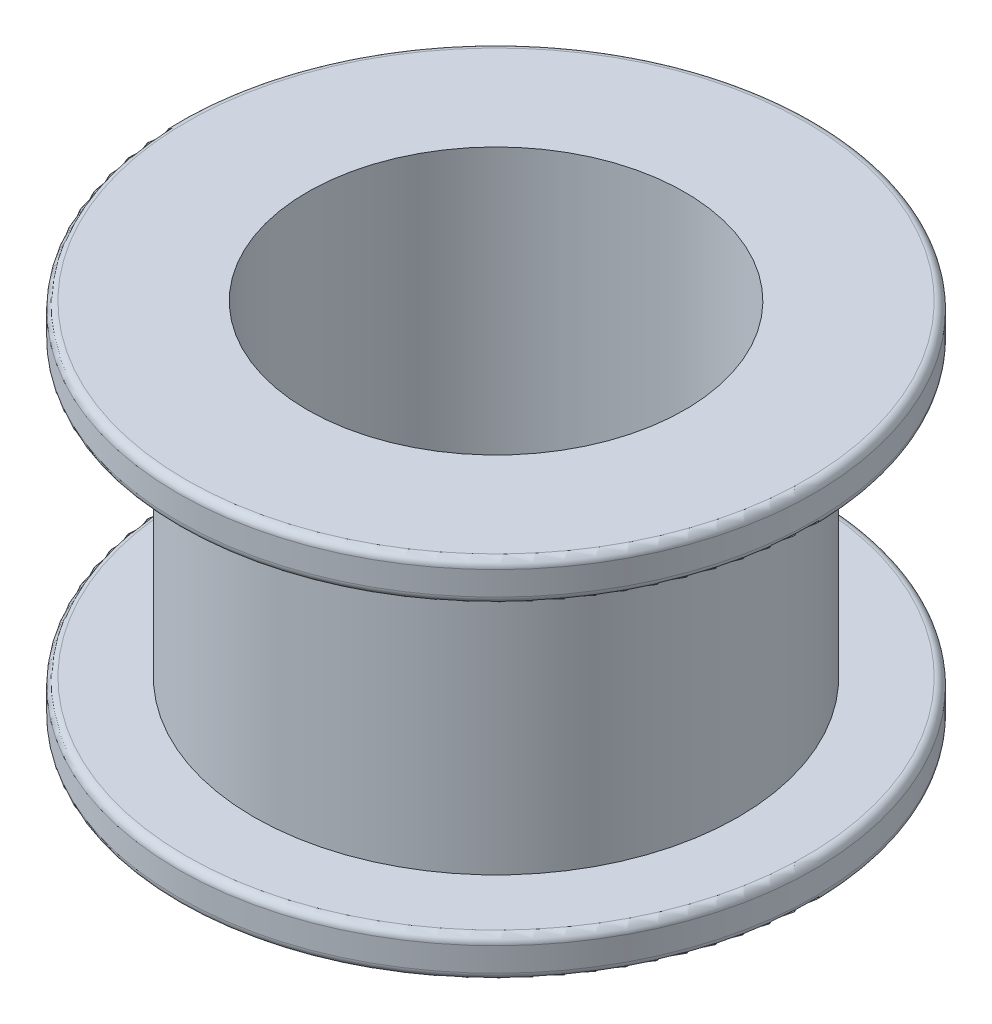
ISO-10303-21;
HEADER;
FILE_DESCRIPTION(('STEP AP214'),'2;1');
FILE_NAME('part.step','',(''),(''),'','','');
FILE_SCHEMA(('AUTOMOTIVE_DESIGN { 1 0 10303 214 1 1 1 1 }'));
ENDSEC;
DATA;
#1=APPLICATION_CONTEXT('core data for automotive mechanical design processes');
#2=APPLICATION_PROTOCOL_DEFINITION('international standard','automotive_design',2000,#1);
#3=PRODUCT_CONTEXT('',#1,'mechanical');
#4=PRODUCT('Part','Part','',(#3));
#5=PRODUCT_RELATED_PRODUCT_CATEGORY('part','',(#4));
#6=PRODUCT_DEFINITION_FORMATION('','',#4);
#7=PRODUCT_DEFINITION_CONTEXT('part definition',#1,'design');
#8=PRODUCT_DEFINITION('design','',#6,#7);
#9=PRODUCT_DEFINITION_SHAPE('','',#8);
#10=(LENGTH_UNIT() NAMED_UNIT(*) SI_UNIT(.MILLI.,.METRE.));
#11=(NAMED_UNIT(*) PLANE_ANGLE_UNIT() SI_UNIT($,.RADIAN.));
#12=(NAMED_UNIT(*) SI_UNIT($,.STERADIAN.) SOLID_ANGLE_UNIT());
#13=UNCERTAINTY_MEASURE_WITH_UNIT(LENGTH_MEASURE(1.E-05),#10,'distance_accuracy_value','');
#14=(GEOMETRIC_REPRESENTATION_CONTEXT(3) GLOBAL_UNCERTAINTY_ASSIGNED_CONTEXT((#13)) GLOBAL_UNIT_ASSIGNED_CONTEXT((#10,
#11,#12)) REPRESENTATION_CONTEXT('',''));
#15=CARTESIAN_POINT('',(0.,0.,0.));
#16=DIRECTION('',(0.,0.,1.));
#17=DIRECTION('',(1.,0.,0.));
#18=AXIS2_PLACEMENT_3D('',#15,#16,#17);
#19=CARTESIAN_POINT('',(0.,9.2,0.));
#20=DIRECTION('',(0.,-1.,0.));
#21=DIRECTION('',(0.,0.,-1.));
#22=AXIS2_PLACEMENT_3D('',#19,#20,#21);
#23=CYLINDRICAL_SURFACE('',#22,6.1);
#24=CARTESIAN_POINT('',(0.,1.,0.));
#25=DIRECTION('',(0.,1.,0.));
#26=DIRECTION('',(0.,0.,1.));
#27=AXIS2_PLACEMENT_3D('',#24,#25,#26);
#28=CIRCLE('',#27,6.1);
#29=CARTESIAN_POINT('',(0.,1.,6.1));
#30=VERTEX_POINT('',#29);
#31=EDGE_CURVE('E70',#30,#30,#28,.T.);
#32=ORIENTED_EDGE('',*,*,#31,.T.);
#33=EDGE_LOOP('',(#32));
#34=FACE_BOUND('',#33,.T.);
#35=CARTESIAN_POINT('',(0.,8.2,0.));
#36=DIRECTION('',(0.,1.,0.));
#37=DIRECTION('',(0.,0.,1.));
#38=AXIS2_PLACEMENT_3D('',#35,#36,#37);
#39=CIRCLE('',#38,6.1);
#40=CARTESIAN_POINT('',(0.,8.2,6.1));
#41=VERTEX_POINT('',#40);
#42=EDGE_CURVE('E63',#41,#41,#39,.T.);
#43=ORIENTED_EDGE('',*,*,#42,.F.);
#44=EDGE_LOOP('',(#43));
#45=FACE_BOUND('',#44,.T.);
#46=ADVANCED_FACE('F31',(#34,#45),#23,.T.);
#47=CARTESIAN_POINT('',(0.,9.2,0.));
#48=DIRECTION('',(0.,-1.,0.));
#49=DIRECTION('',(0.,0.,-1.));
#50=AXIS2_PLACEMENT_3D('',#47,#48,#49);
#51=CYLINDRICAL_SURFACE('',#50,4.75);
#52=CARTESIAN_POINT('',(0.,9.2,0.));
#53=DIRECTION('',(0.,1.,0.));
#54=DIRECTION('',(0.,0.,1.));
#55=AXIS2_PLACEMENT_3D('',#52,#53,#54);
#56=CIRCLE('',#55,4.75);
#57=CARTESIAN_POINT('',(0.,9.2,4.75));
#58=VERTEX_POINT('',#57);
#59=EDGE_CURVE('E66',#58,#58,#56,.T.);
#60=ORIENTED_EDGE('',*,*,#59,.T.);
#61=EDGE_LOOP('',(#60));
#62=FACE_BOUND('',#61,.T.);
#63=CARTESIAN_POINT('',(0.,0.,0.));
#64=DIRECTION('',(0.,1.,0.));
#65=DIRECTION('',(0.,0.,1.));
#66=AXIS2_PLACEMENT_3D('',#63,#64,#65);
#67=CIRCLE('',#66,4.75);
#68=CARTESIAN_POINT('',(0.,0.,4.75));
#69=VERTEX_POINT('',#68);
#70=EDGE_CURVE('E67',#69,#69,#67,.T.);
#71=ORIENTED_EDGE('',*,*,#70,.F.);
#72=EDGE_LOOP('',(#71));
#73=FACE_BOUND('',#72,.T.);
#74=ADVANCED_FACE('F94',(#62,#73),#51,.F.);
#75=CARTESIAN_POINT('',(0.,9.2,0.));
#76=DIRECTION('',(0.,1.,0.));
#77=DIRECTION('',(0.,0.,1.));
#78=AXIS2_PLACEMENT_3D('',#75,#76,#77);
#79=PLANE('',#78);
#80=CARTESIAN_POINT('',(0.,9.2,0.));
#81=DIRECTION('',(0.,1.,0.));
#82=DIRECTION('',(0.,0.,1.));
#83=AXIS2_PLACEMENT_3D('',#80,#81,#82);
#84=CIRCLE('',#83,7.8);
#85=CARTESIAN_POINT('',(0.,9.2,7.8));
#86=VERTEX_POINT('',#85);
#87=EDGE_CURVE('E60',#86,#86,#84,.T.);
#88=ORIENTED_EDGE('',*,*,#87,.T.);
#89=EDGE_LOOP('',(#88));
#90=FACE_BOUND('',#89,.T.);
#91=ORIENTED_EDGE('',*,*,#59,.F.);
#92=EDGE_LOOP('',(#91));
#93=FACE_BOUND('',#92,.T.);
#94=ADVANCED_FACE('F99',(#90,#93),#79,.T.);
#95=CARTESIAN_POINT('',(0.,0.,0.));
#96=DIRECTION('',(0.,1.,0.));
#97=DIRECTION('',(0.,0.,1.));
#98=AXIS2_PLACEMENT_3D('',#95,#96,#97);
#99=PLANE('',#98);
#100=CARTESIAN_POINT('',(0.,0.,0.));
#101=DIRECTION('',(0.,1.,0.));
#102=DIRECTION('',(0.,0.,1.));
#103=AXIS2_PLACEMENT_3D('',#100,#101,#102);
#104=CIRCLE('',#103,7.8);
#105=CARTESIAN_POINT('',(0.,0.,7.8));
#106=VERTEX_POINT('',#105);
#107=EDGE_CURVE('E38',#106,#106,#104,.F.);
#108=ORIENTED_EDGE('',*,*,#107,.T.);
#109=EDGE_LOOP('',(#108));
#110=FACE_BOUND('',#109,.T.);
#111=ORIENTED_EDGE('',*,*,#70,.T.);
#112=EDGE_LOOP('',(#111));
#113=FACE_BOUND('',#112,.T.);
#114=ADVANCED_FACE('F90',(#110,#113),#99,.F.);
#115=CARTESIAN_POINT('',(0.,1.,0.));
#116=DIRECTION('',(0.,-1.,0.));
#117=DIRECTION('',(0.,0.,-1.));
#118=AXIS2_PLACEMENT_3D('',#115,#116,#117);
#119=CYLINDRICAL_SURFACE('',#118,8.);
#120=CARTESIAN_POINT('',(0.,0.2,0.));
#121=DIRECTION('',(0.,1.,0.));
#122=DIRECTION('',(0.,0.,1.));
#123=AXIS2_PLACEMENT_3D('',#120,#121,#122);
#124=CIRCLE('',#123,8.);
#125=CARTESIAN_POINT('',(0.,0.2,8.));
#126=VERTEX_POINT('',#125);
#127=EDGE_CURVE('E42',#126,#126,#124,.T.);
#128=ORIENTED_EDGE('',*,*,#127,.T.);
#129=EDGE_LOOP('',(#128));
#130=FACE_BOUND('',#129,.T.);
#131=CARTESIAN_POINT('',(0.,0.8,0.));
#132=DIRECTION('',(0.,1.,0.));
#133=DIRECTION('',(0.,0.,1.));
#134=AXIS2_PLACEMENT_3D('',#131,#132,#133);
#135=CIRCLE('',#134,8.);
#136=CARTESIAN_POINT('',(0.,0.8,8.));
#137=VERTEX_POINT('',#136);
#138=EDGE_CURVE('E46',#137,#137,#135,.F.);
#139=ORIENTED_EDGE('',*,*,#138,.T.);
#140=EDGE_LOOP('',(#139));
#141=FACE_BOUND('',#140,.T.);
#142=ADVANCED_FACE('F81',(#130,#141),#119,.T.);
#143=CARTESIAN_POINT('',(0.,1.,0.));
#144=DIRECTION('',(0.,1.,0.));
#145=DIRECTION('',(0.,0.,1.));
#146=AXIS2_PLACEMENT_3D('',#143,#144,#145);
#147=PLANE('',#146);
#148=CARTESIAN_POINT('',(0.,1.,0.));
#149=DIRECTION('',(0.,1.,0.));
#150=DIRECTION('',(0.,0.,1.));
#151=AXIS2_PLACEMENT_3D('',#148,#149,#150);
#152=CIRCLE('',#151,7.8);
#153=CARTESIAN_POINT('',(0.,1.,7.8));
#154=VERTEX_POINT('',#153);
#155=EDGE_CURVE('E10',#154,#154,#152,.T.);
#156=ORIENTED_EDGE('',*,*,#155,.T.);
#157=EDGE_LOOP('',(#156));
#158=FACE_BOUND('',#157,.T.);
#159=ORIENTED_EDGE('',*,*,#31,.F.);
#160=EDGE_LOOP('',(#159));
#161=FACE_BOUND('',#160,.T.);
#162=ADVANCED_FACE('F78',(#158,#161),#147,.T.);
#163=CARTESIAN_POINT('',(0.,8.2,0.));
#164=DIRECTION('',(0.,1.,0.));
#165=DIRECTION('',(0.,0.,1.));
#166=AXIS2_PLACEMENT_3D('',#163,#164,#165);
#167=CYLINDRICAL_SURFACE('',#166,8.);
#168=CARTESIAN_POINT('',(0.,9.,0.));
#169=DIRECTION('',(0.,1.,0.));
#170=DIRECTION('',(0.,0.,1.));
#171=AXIS2_PLACEMENT_3D('',#168,#169,#170);
#172=CIRCLE('',#171,8.);
#173=CARTESIAN_POINT('',(0.,9.,8.));
#174=VERTEX_POINT('',#173);
#175=EDGE_CURVE('E54',#174,#174,#172,.F.);
#176=ORIENTED_EDGE('',*,*,#175,.T.);
#177=EDGE_LOOP('',(#176));
#178=FACE_BOUND('',#177,.T.);
#179=CARTESIAN_POINT('',(0.,8.4,0.));
#180=DIRECTION('',(0.,1.,0.));
#181=DIRECTION('',(0.,0.,1.));
#182=AXIS2_PLACEMENT_3D('',#179,#180,#181);
#183=CIRCLE('',#182,8.);
#184=CARTESIAN_POINT('',(0.,8.4,8.));
#185=VERTEX_POINT('',#184);
#186=EDGE_CURVE('E57',#185,#185,#183,.T.);
#187=ORIENTED_EDGE('',*,*,#186,.T.);
#188=EDGE_LOOP('',(#187));
#189=FACE_BOUND('',#188,.T.);
#190=ADVANCED_FACE('F80',(#178,#189),#167,.T.);
#191=CARTESIAN_POINT('',(0.,8.2,0.));
#192=DIRECTION('',(0.,1.,0.));
#193=DIRECTION('',(0.,0.,1.));
#194=AXIS2_PLACEMENT_3D('',#191,#192,#193);
#195=PLANE('',#194);
#196=CARTESIAN_POINT('',(0.,8.2,0.));
#197=DIRECTION('',(0.,1.,0.));
#198=DIRECTION('',(0.,0.,1.));
#199=AXIS2_PLACEMENT_3D('',#196,#197,#198);
#200=CIRCLE('',#199,7.8);
#201=CARTESIAN_POINT('',(0.,8.2,7.8));
#202=VERTEX_POINT('',#201);
#203=EDGE_CURVE('E51',#202,#202,#200,.F.);
#204=ORIENTED_EDGE('',*,*,#203,.T.);
#205=EDGE_LOOP('',(#204));
#206=FACE_BOUND('',#205,.T.);
#207=ORIENTED_EDGE('',*,*,#42,.T.);
#208=EDGE_LOOP('',(#207));
#209=FACE_BOUND('',#208,.T.);
#210=ADVANCED_FACE('F87',(#206,#209),#195,.F.);
#211=CARTESIAN_POINT('',(0.,9.,0.));
#212=DIRECTION('',(0.,1.,0.));
#213=DIRECTION('',(0.,0.,1.));
#214=AXIS2_PLACEMENT_3D('',#211,#212,#213);
#215=TOROIDAL_SURFACE('',#214,7.8,0.2);
#216=ORIENTED_EDGE('',*,*,#175,.F.);
#217=EDGE_LOOP('',(#216));
#218=FACE_BOUND('',#217,.T.);
#219=ORIENTED_EDGE('',*,*,#87,.F.);
#220=EDGE_LOOP('',(#219));
#221=FACE_BOUND('',#220,.T.);
#222=ADVANCED_FACE('F105',(#218,#221),#215,.T.);
#223=CARTESIAN_POINT('',(0.,8.4,0.));
#224=DIRECTION('',(0.,1.,0.));
#225=DIRECTION('',(0.,0.,1.));
#226=AXIS2_PLACEMENT_3D('',#223,#224,#225);
#227=TOROIDAL_SURFACE('',#226,7.8,0.2);
#228=ORIENTED_EDGE('',*,*,#203,.F.);
#229=EDGE_LOOP('',(#228));
#230=FACE_BOUND('',#229,.T.);
#231=ORIENTED_EDGE('',*,*,#186,.F.);
#232=EDGE_LOOP('',(#231));
#233=FACE_BOUND('',#232,.T.);
#234=ADVANCED_FACE('F108',(#230,#233),#227,.T.);
#235=CARTESIAN_POINT('',(0.,0.2,0.));
#236=DIRECTION('',(0.,1.,0.));
#237=DIRECTION('',(0.,0.,1.));
#238=AXIS2_PLACEMENT_3D('',#235,#236,#237);
#239=TOROIDAL_SURFACE('',#238,7.8,0.2);
#240=ORIENTED_EDGE('',*,*,#107,.F.);
#241=EDGE_LOOP('',(#240));
#242=FACE_BOUND('',#241,.T.);
#243=ORIENTED_EDGE('',*,*,#127,.F.);
#244=EDGE_LOOP('',(#243));
#245=FACE_BOUND('',#244,.T.);
#246=ADVANCED_FACE('F111',(#242,#245),#239,.T.);
#247=CARTESIAN_POINT('',(0.,0.8,0.));
#248=DIRECTION('',(0.,1.,0.));
#249=DIRECTION('',(0.,0.,1.));
#250=AXIS2_PLACEMENT_3D('',#247,#248,#249);
#251=TOROIDAL_SURFACE('',#250,7.8,0.2);
#252=ORIENTED_EDGE('',*,*,#138,.F.);
#253=EDGE_LOOP('',(#252));
#254=FACE_BOUND('',#253,.T.);
#255=ORIENTED_EDGE('',*,*,#155,.F.);
#256=EDGE_LOOP('',(#255));
#257=FACE_BOUND('',#256,.T.);
#258=ADVANCED_FACE('F33',(#254,#257),#251,.T.);
#259=CLOSED_SHELL('',(#46,#74,#94,#114,#142,#162,#190,#210,#222,#234,#246,#258));
#260=MANIFOLD_SOLID_BREP('B2',#259);
#261=ADVANCED_BREP_SHAPE_REPRESENTATION('',(#18,#260),#14);
#262=SHAPE_DEFINITION_REPRESENTATION(#9,#261);
ENDSEC;
END-ISO-10303-21;
